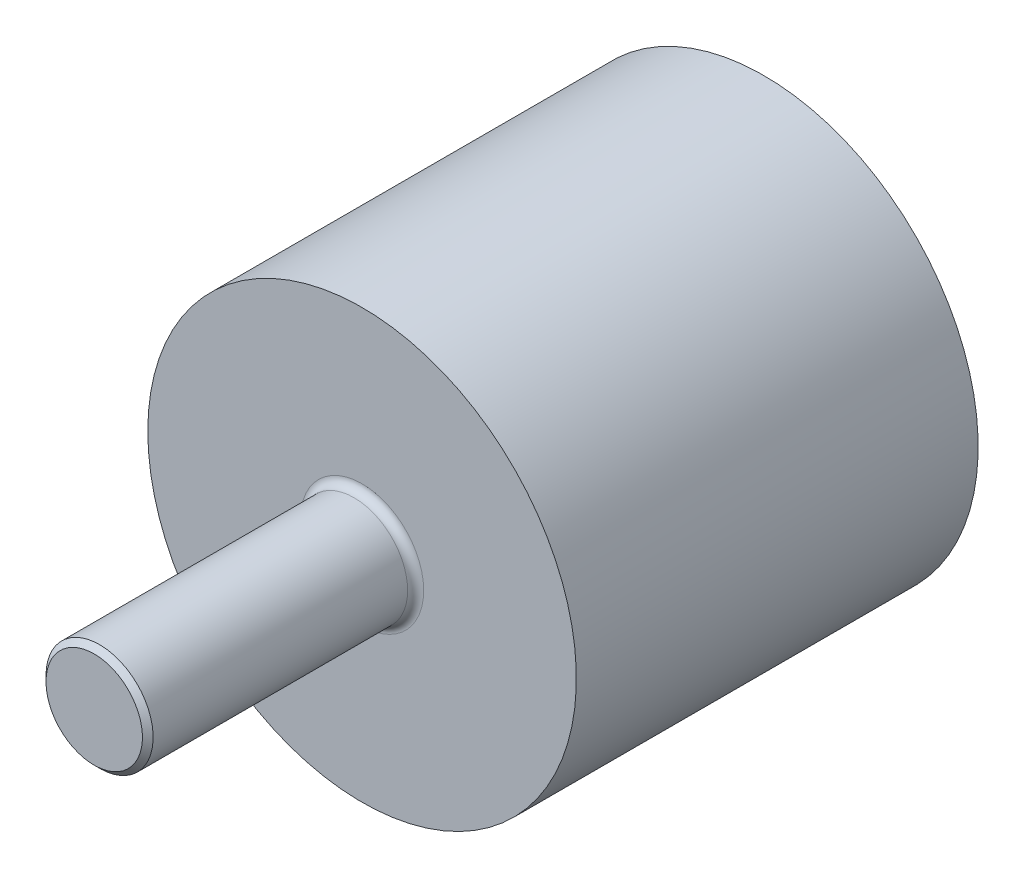
ISO-10303-21;
HEADER;
FILE_DESCRIPTION(('STEP AP214'),'2;1');
FILE_NAME('part.step','',(''),(''),'','','');
FILE_SCHEMA(('AUTOMOTIVE_DESIGN { 1 0 10303 214 1 1 1 1 }'));
ENDSEC;
DATA;
#1=APPLICATION_CONTEXT('core data for automotive mechanical design processes');
#2=APPLICATION_PROTOCOL_DEFINITION('international standard','automotive_design',2000,#1);
#3=PRODUCT_CONTEXT('',#1,'mechanical');
#4=PRODUCT('Part','Part','',(#3));
#5=PRODUCT_RELATED_PRODUCT_CATEGORY('part','',(#4));
#6=PRODUCT_DEFINITION_FORMATION('','',#4);
#7=PRODUCT_DEFINITION_CONTEXT('part definition',#1,'design');
#8=PRODUCT_DEFINITION('design','',#6,#7);
#9=PRODUCT_DEFINITION_SHAPE('','',#8);
#10=(LENGTH_UNIT() NAMED_UNIT(*) SI_UNIT(.MILLI.,.METRE.));
#11=(NAMED_UNIT(*) PLANE_ANGLE_UNIT() SI_UNIT($,.RADIAN.));
#12=(NAMED_UNIT(*) SI_UNIT($,.STERADIAN.) SOLID_ANGLE_UNIT());
#13=UNCERTAINTY_MEASURE_WITH_UNIT(LENGTH_MEASURE(1.E-05),#10,'distance_accuracy_value','');
#14=(GEOMETRIC_REPRESENTATION_CONTEXT(3) GLOBAL_UNCERTAINTY_ASSIGNED_CONTEXT((#13)) GLOBAL_UNIT_ASSIGNED_CONTEXT((#10,
#11,#12)) REPRESENTATION_CONTEXT('',''));
#15=CARTESIAN_POINT('',(0.,0.,0.));
#16=DIRECTION('',(0.,0.,1.));
#17=DIRECTION('',(1.,0.,0.));
#18=AXIS2_PLACEMENT_3D('',#15,#16,#17);
#19=CARTESIAN_POINT('',(0.,0.,0.));
#20=DIRECTION('',(0.,0.,1.));
#21=DIRECTION('',(0.,-1.,0.));
#22=AXIS2_PLACEMENT_3D('',#19,#20,#21);
#23=PLANE('',#22);
#24=CARTESIAN_POINT('',(0.,0.,0.));
#25=DIRECTION('',(0.,0.,-1.));
#26=DIRECTION('',(-1.,0.,0.));
#27=AXIS2_PLACEMENT_3D('',#24,#25,#26);
#28=CIRCLE('',#27,1.80000000005975);
#29=CARTESIAN_POINT('',(-1.80000000005975,0.,0.));
#30=VERTEX_POINT('',#29);
#31=EDGE_CURVE('E16',#30,#30,#28,.T.);
#32=ORIENTED_EDGE('',*,*,#31,.F.);
#33=EDGE_LOOP('',(#32));
#34=FACE_BOUND('',#33,.T.);
#35=ADVANCED_FACE('F13',(#34),#23,.T.);
#36=CARTESIAN_POINT('',(2.,0.,-21.));
#37=DIRECTION('',(0.,0.,-1.));
#38=DIRECTION('',(-1.,0.,0.));
#39=AXIS2_PLACEMENT_3D('',#36,#37,#38);
#40=PLANE('',#39);
#41=CARTESIAN_POINT('',(0.,0.,-21.));
#42=DIRECTION('',(0.,0.,-1.));
#43=DIRECTION('',(-1.,0.,0.));
#44=AXIS2_PLACEMENT_3D('',#41,#42,#43);
#45=CIRCLE('',#44,2.00000000000001);
#46=CARTESIAN_POINT('',(-2.00000000000001,0.,-21.));
#47=VERTEX_POINT('',#46);
#48=EDGE_CURVE('E34',#47,#47,#45,.T.);
#49=ORIENTED_EDGE('',*,*,#48,.T.);
#50=EDGE_LOOP('',(#49));
#51=FACE_BOUND('',#50,.T.);
#52=ADVANCED_FACE('F46',(#51),#40,.T.);
#53=CARTESIAN_POINT('',(0.,0.,-0.200000000063483));
#54=DIRECTION('',(0.,0.,-1.));
#55=DIRECTION('',(-1.,0.,0.));
#56=AXIS2_PLACEMENT_3D('',#53,#54,#55);
#57=CONICAL_SURFACE('',#56,2.00000000012324,0.785398163397448);
#58=CARTESIAN_POINT('',(0.,0.,-0.2));
#59=DIRECTION('',(0.,0.,-1.));
#60=DIRECTION('',(-1.,0.,0.));
#61=AXIS2_PLACEMENT_3D('',#58,#59,#60);
#62=CIRCLE('',#61,2.);
#63=CARTESIAN_POINT('',(-2.,0.,-0.2));
#64=VERTEX_POINT('',#63);
#65=EDGE_CURVE('E28',#64,#64,#62,.T.);
#66=ORIENTED_EDGE('',*,*,#65,.F.);
#67=EDGE_LOOP('',(#66));
#68=FACE_BOUND('',#67,.T.);
#69=ORIENTED_EDGE('',*,*,#31,.T.);
#70=EDGE_LOOP('',(#69));
#71=FACE_BOUND('',#70,.T.);
#72=ADVANCED_FACE('F43',(#68,#71),#57,.T.);
#73=CARTESIAN_POINT('',(0.,0.,-23.));
#74=DIRECTION('',(0.,0.,-1.));
#75=DIRECTION('',(-1.,0.,0.));
#76=AXIS2_PLACEMENT_3D('',#73,#74,#75);
#77=CYLINDRICAL_SURFACE('',#76,2.00000000000001);
#78=ORIENTED_EDGE('',*,*,#48,.F.);
#79=EDGE_LOOP('',(#78));
#80=FACE_BOUND('',#79,.T.);
#81=CARTESIAN_POINT('',(0.,0.,-24.7999999999706));
#82=DIRECTION('',(0.,0.,-1.));
#83=DIRECTION('',(-1.,0.,0.));
#84=AXIS2_PLACEMENT_3D('',#81,#82,#83);
#85=CIRCLE('',#84,2.00000000000955);
#86=CARTESIAN_POINT('',(-2.00000000000955,0.,-24.7999999999706));
#87=VERTEX_POINT('',#86);
#88=EDGE_CURVE('E39',#87,#87,#85,.T.);
#89=ORIENTED_EDGE('',*,*,#88,.T.);
#90=EDGE_LOOP('',(#89));
#91=FACE_BOUND('',#90,.T.);
#92=ADVANCED_FACE('F105',(#80,#91),#77,.F.);
#93=CARTESIAN_POINT('',(0.,0.,-5.));
#94=DIRECTION('',(0.,0.,-1.));
#95=DIRECTION('',(-1.,0.,0.));
#96=AXIS2_PLACEMENT_3D('',#93,#94,#95);
#97=CYLINDRICAL_SURFACE('',#96,2.);
#98=ORIENTED_EDGE('',*,*,#65,.T.);
#99=EDGE_LOOP('',(#98));
#100=FACE_BOUND('',#99,.T.);
#101=CARTESIAN_POINT('',(0.,0.,-9.7));
#102=DIRECTION('',(0.,0.,1.));
#103=DIRECTION('',(1.,0.,0.));
#104=AXIS2_PLACEMENT_3D('',#101,#102,#103);
#105=CIRCLE('',#104,2.);
#106=CARTESIAN_POINT('',(2.,0.,-9.7));
#107=VERTEX_POINT('',#106);
#108=EDGE_CURVE('E33',#107,#107,#105,.T.);
#109=ORIENTED_EDGE('',*,*,#108,.T.);
#110=EDGE_LOOP('',(#109));
#111=FACE_BOUND('',#110,.T.);
#112=ADVANCED_FACE('F101',(#100,#111),#97,.T.);
#113=CARTESIAN_POINT('',(0.,0.,-25.0000000001478));
#114=DIRECTION('',(0.,0.,-1.));
#115=DIRECTION('',(-1.,0.,0.));
#116=AXIS2_PLACEMENT_3D('',#113,#114,#115);
#117=CONICAL_SURFACE('',#116,2.20000000018672,0.785398163397448);
#118=CARTESIAN_POINT('',(0.,0.,-25.0000000000341));
#119=DIRECTION('',(0.,0.,-1.));
#120=DIRECTION('',(-1.,0.,0.));
#121=AXIS2_PLACEMENT_3D('',#118,#119,#120);
#122=CIRCLE('',#121,2.20000000007303);
#123=CARTESIAN_POINT('',(-2.20000000007303,0.,-25.0000000000341));
#124=VERTEX_POINT('',#123);
#125=EDGE_CURVE('E31',#124,#124,#122,.F.);
#126=ORIENTED_EDGE('',*,*,#125,.F.);
#127=EDGE_LOOP('',(#126));
#128=FACE_BOUND('',#127,.T.);
#129=ORIENTED_EDGE('',*,*,#88,.F.);
#130=EDGE_LOOP('',(#129));
#131=FACE_BOUND('',#130,.T.);
#132=ADVANCED_FACE('F83',(#128,#131),#117,.F.);
#133=CARTESIAN_POINT('',(0.,0.,-9.7));
#134=DIRECTION('',(0.,0.,1.));
#135=DIRECTION('',(1.,0.,0.));
#136=AXIS2_PLACEMENT_3D('',#133,#134,#135);
#137=TOROIDAL_SURFACE('',#136,2.3,0.3);
#138=ORIENTED_EDGE('',*,*,#108,.F.);
#139=EDGE_LOOP('',(#138));
#140=FACE_BOUND('',#139,.T.);
#141=CARTESIAN_POINT('',(0.,0.,-10.));
#142=DIRECTION('',(0.,0.,1.));
#143=DIRECTION('',(1.,0.,0.));
#144=AXIS2_PLACEMENT_3D('',#141,#142,#143);
#145=CIRCLE('',#144,2.3);
#146=CARTESIAN_POINT('',(2.3,0.,-10.));
#147=VERTEX_POINT('',#146);
#148=EDGE_CURVE('E25',#147,#147,#145,.F.);
#149=ORIENTED_EDGE('',*,*,#148,.F.);
#150=EDGE_LOOP('',(#149));
#151=FACE_BOUND('',#150,.T.);
#152=ADVANCED_FACE('F79',(#140,#151),#137,.F.);
#153=CARTESIAN_POINT('',(8.,0.,-25.));
#154=DIRECTION('',(0.,0.,-1.));
#155=DIRECTION('',(-1.,0.,0.));
#156=AXIS2_PLACEMENT_3D('',#153,#154,#155);
#157=PLANE('',#156);
#158=ORIENTED_EDGE('',*,*,#125,.T.);
#159=EDGE_LOOP('',(#158));
#160=FACE_BOUND('',#159,.T.);
#161=CARTESIAN_POINT('',(0.,0.,-25.));
#162=DIRECTION('',(0.,0.,-1.));
#163=DIRECTION('',(-1.,0.,0.));
#164=AXIS2_PLACEMENT_3D('',#161,#162,#163);
#165=CIRCLE('',#164,8.);
#166=CARTESIAN_POINT('',(-8.,0.,-25.));
#167=VERTEX_POINT('',#166);
#168=EDGE_CURVE('E20',#167,#167,#165,.F.);
#169=ORIENTED_EDGE('',*,*,#168,.F.);
#170=EDGE_LOOP('',(#169));
#171=FACE_BOUND('',#170,.T.);
#172=ADVANCED_FACE('F59',(#160,#171),#157,.T.);
#173=CARTESIAN_POINT('',(2.,0.,-10.));
#174=DIRECTION('',(0.,0.,1.));
#175=DIRECTION('',(0.,-1.,0.));
#176=AXIS2_PLACEMENT_3D('',#173,#174,#175);
#177=PLANE('',#176);
#178=ORIENTED_EDGE('',*,*,#148,.T.);
#179=EDGE_LOOP('',(#178));
#180=FACE_BOUND('',#179,.T.);
#181=CARTESIAN_POINT('',(0.,0.,-10.));
#182=DIRECTION('',(0.,0.,-1.));
#183=DIRECTION('',(-1.,0.,0.));
#184=AXIS2_PLACEMENT_3D('',#181,#182,#183);
#185=CIRCLE('',#184,8.);
#186=CARTESIAN_POINT('',(-8.,0.,-10.));
#187=VERTEX_POINT('',#186);
#188=EDGE_CURVE('E9',#187,#187,#185,.T.);
#189=ORIENTED_EDGE('',*,*,#188,.F.);
#190=EDGE_LOOP('',(#189));
#191=FACE_BOUND('',#190,.T.);
#192=ADVANCED_FACE('F53',(#180,#191),#177,.T.);
#193=CARTESIAN_POINT('',(0.,0.,-17.5));
#194=DIRECTION('',(0.,0.,-1.));
#195=DIRECTION('',(-1.,0.,0.));
#196=AXIS2_PLACEMENT_3D('',#193,#194,#195);
#197=CYLINDRICAL_SURFACE('',#196,8.);
#198=ORIENTED_EDGE('',*,*,#168,.T.);
#199=EDGE_LOOP('',(#198));
#200=FACE_BOUND('',#199,.T.);
#201=ORIENTED_EDGE('',*,*,#188,.T.);
#202=EDGE_LOOP('',(#201));
#203=FACE_BOUND('',#202,.T.);
#204=ADVANCED_FACE('F51',(#200,#203),#197,.T.);
#205=CLOSED_SHELL('',(#35,#52,#72,#92,#112,#132,#152,#172,#192,#204));
#206=MANIFOLD_SOLID_BREP('B1',#205);
#207=ADVANCED_BREP_SHAPE_REPRESENTATION('',(#18,#206),#14);
#208=SHAPE_DEFINITION_REPRESENTATION(#9,#207);
ENDSEC;
END-ISO-10303-21;
